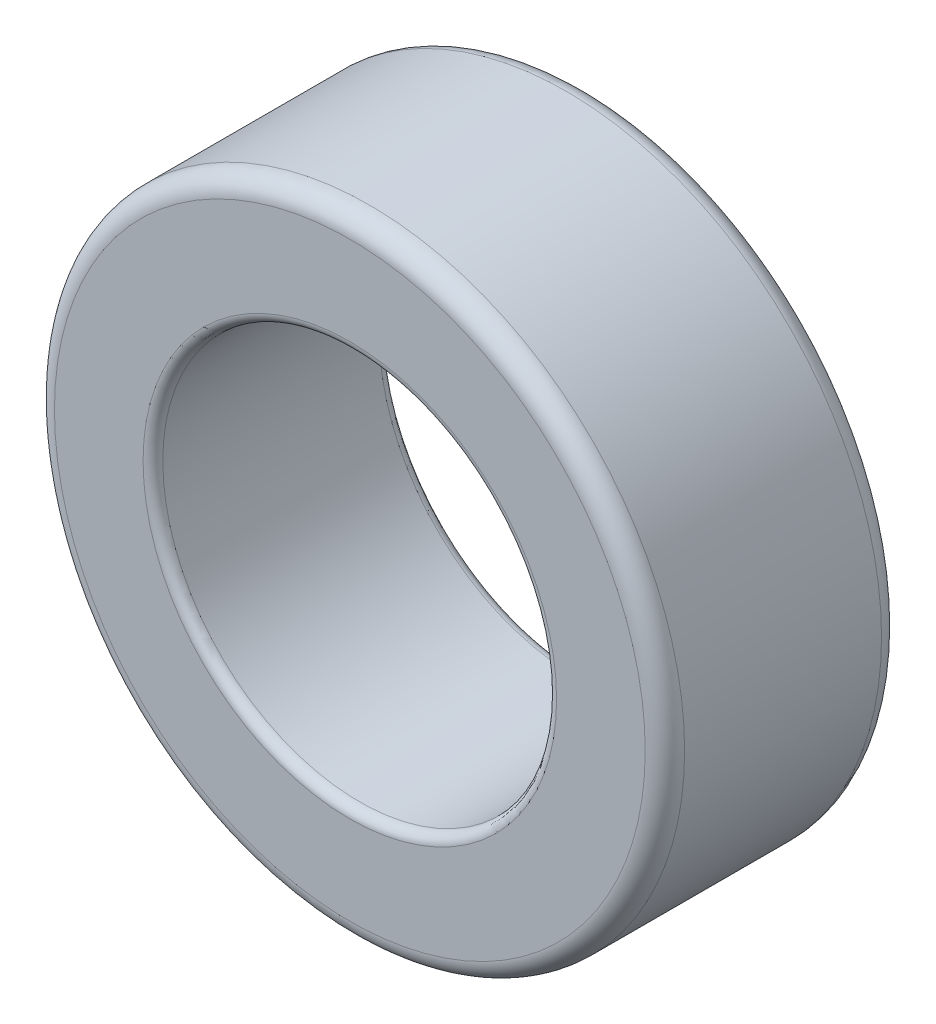
ISO-10303-21;
HEADER;
FILE_DESCRIPTION(('STEP AP214'),'2;1');
FILE_NAME('part.step','',(''),(''),'','','');
FILE_SCHEMA(('AUTOMOTIVE_DESIGN { 1 0 10303 214 1 1 1 1 }'));
ENDSEC;
DATA;
#1=APPLICATION_CONTEXT('core data for automotive mechanical design processes');
#2=APPLICATION_PROTOCOL_DEFINITION('international standard','automotive_design',2000,#1);
#3=PRODUCT_CONTEXT('',#1,'mechanical');
#4=PRODUCT('Part','Part','',(#3));
#5=PRODUCT_RELATED_PRODUCT_CATEGORY('part','',(#4));
#6=PRODUCT_DEFINITION_FORMATION('','',#4);
#7=PRODUCT_DEFINITION_CONTEXT('part definition',#1,'design');
#8=PRODUCT_DEFINITION('design','',#6,#7);
#9=PRODUCT_DEFINITION_SHAPE('','',#8);
#10=(LENGTH_UNIT() NAMED_UNIT(*) SI_UNIT(.MILLI.,.METRE.));
#11=(NAMED_UNIT(*) PLANE_ANGLE_UNIT() SI_UNIT($,.RADIAN.));
#12=(NAMED_UNIT(*) SI_UNIT($,.STERADIAN.) SOLID_ANGLE_UNIT());
#13=UNCERTAINTY_MEASURE_WITH_UNIT(LENGTH_MEASURE(1.E-05),#10,'distance_accuracy_value','');
#14=(GEOMETRIC_REPRESENTATION_CONTEXT(3) GLOBAL_UNCERTAINTY_ASSIGNED_CONTEXT((#13)) GLOBAL_UNIT_ASSIGNED_CONTEXT((#10,
#11,#12)) REPRESENTATION_CONTEXT('',''));
#15=CARTESIAN_POINT('',(0.,0.,0.));
#16=DIRECTION('',(0.,0.,1.));
#17=DIRECTION('',(1.,0.,0.));
#18=AXIS2_PLACEMENT_3D('',#15,#16,#17);
#19=CARTESIAN_POINT('',(0.,0.,6.));
#20=DIRECTION('',(0.,0.,-1.));
#21=DIRECTION('',(-1.,0.,0.));
#22=AXIS2_PLACEMENT_3D('',#19,#20,#21);
#23=CYLINDRICAL_SURFACE('',#22,10.);
#24=CARTESIAN_POINT('',(0.,0.,-5.5));
#25=DIRECTION('',(0.,0.,1.));
#26=DIRECTION('',(1.,0.,0.));
#27=AXIS2_PLACEMENT_3D('',#24,#25,#26);
#28=CIRCLE('',#27,10.);
#29=CARTESIAN_POINT('',(10.,0.,-5.5));
#30=VERTEX_POINT('',#29);
#31=EDGE_CURVE('E40',#30,#30,#28,.F.);
#32=ORIENTED_EDGE('',*,*,#31,.T.);
#33=EDGE_LOOP('',(#32));
#34=FACE_BOUND('',#33,.T.);
#35=CARTESIAN_POINT('',(0.,0.,5.5));
#36=DIRECTION('',(0.,0.,1.));
#37=DIRECTION('',(1.,0.,0.));
#38=AXIS2_PLACEMENT_3D('',#35,#36,#37);
#39=CIRCLE('',#38,10.);
#40=CARTESIAN_POINT('',(10.,0.,5.5));
#41=VERTEX_POINT('',#40);
#42=EDGE_CURVE('E44',#41,#41,#39,.T.);
#43=ORIENTED_EDGE('',*,*,#42,.T.);
#44=EDGE_LOOP('',(#43));
#45=FACE_BOUND('',#44,.T.);
#46=ADVANCED_FACE('F33',(#34,#45),#23,.F.);
#47=CARTESIAN_POINT('',(0.,0.,6.));
#48=DIRECTION('',(0.,0.,-1.));
#49=DIRECTION('',(-1.,0.,0.));
#50=AXIS2_PLACEMENT_3D('',#47,#48,#49);
#51=CYLINDRICAL_SURFACE('',#50,16.);
#52=CARTESIAN_POINT('',(0.,0.,-5.));
#53=DIRECTION('',(0.,0.,1.));
#54=DIRECTION('',(1.,0.,0.));
#55=AXIS2_PLACEMENT_3D('',#52,#53,#54);
#56=CIRCLE('',#55,16.);
#57=CARTESIAN_POINT('',(16.,0.,-5.));
#58=VERTEX_POINT('',#57);
#59=EDGE_CURVE('E59',#58,#58,#56,.T.);
#60=ORIENTED_EDGE('',*,*,#59,.T.);
#61=EDGE_LOOP('',(#60));
#62=FACE_BOUND('',#61,.T.);
#63=CARTESIAN_POINT('',(0.,0.,5.));
#64=DIRECTION('',(0.,0.,1.));
#65=DIRECTION('',(1.,0.,0.));
#66=AXIS2_PLACEMENT_3D('',#63,#64,#65);
#67=CIRCLE('',#66,16.);
#68=CARTESIAN_POINT('',(16.,0.,5.));
#69=VERTEX_POINT('',#68);
#70=EDGE_CURVE('E62',#69,#69,#67,.F.);
#71=ORIENTED_EDGE('',*,*,#70,.T.);
#72=EDGE_LOOP('',(#71));
#73=FACE_BOUND('',#72,.T.);
#74=ADVANCED_FACE('F66',(#62,#73),#51,.T.);
#75=CARTESIAN_POINT('',(0.,0.,6.));
#76=DIRECTION('',(0.,0.,1.));
#77=DIRECTION('',(1.,0.,0.));
#78=AXIS2_PLACEMENT_3D('',#75,#76,#77);
#79=PLANE('',#78);
#80=CARTESIAN_POINT('',(0.,0.,6.));
#81=DIRECTION('',(0.,0.,1.));
#82=DIRECTION('',(1.,0.,0.));
#83=AXIS2_PLACEMENT_3D('',#80,#81,#82);
#84=CIRCLE('',#83,10.5);
#85=CARTESIAN_POINT('',(10.5,0.,6.));
#86=VERTEX_POINT('',#85);
#87=EDGE_CURVE('E10',#86,#86,#84,.F.);
#88=ORIENTED_EDGE('',*,*,#87,.T.);
#89=EDGE_LOOP('',(#88));
#90=FACE_BOUND('',#89,.T.);
#91=CARTESIAN_POINT('',(0.,0.,6.));
#92=DIRECTION('',(0.,0.,1.));
#93=DIRECTION('',(1.,0.,0.));
#94=AXIS2_PLACEMENT_3D('',#91,#92,#93);
#95=CIRCLE('',#94,15.);
#96=CARTESIAN_POINT('',(15.,0.,6.));
#97=VERTEX_POINT('',#96);
#98=EDGE_CURVE('E53',#97,#97,#95,.T.);
#99=ORIENTED_EDGE('',*,*,#98,.T.);
#100=EDGE_LOOP('',(#99));
#101=FACE_BOUND('',#100,.T.);
#102=ADVANCED_FACE('F76',(#90,#101),#79,.T.);
#103=CARTESIAN_POINT('',(0.,0.,-6.));
#104=DIRECTION('',(0.,0.,1.));
#105=DIRECTION('',(1.,0.,0.));
#106=AXIS2_PLACEMENT_3D('',#103,#104,#105);
#107=PLANE('',#106);
#108=CARTESIAN_POINT('',(0.,0.,-6.));
#109=DIRECTION('',(0.,0.,1.));
#110=DIRECTION('',(1.,0.,0.));
#111=AXIS2_PLACEMENT_3D('',#108,#109,#110);
#112=CIRCLE('',#111,10.5);
#113=CARTESIAN_POINT('',(10.5,0.,-6.));
#114=VERTEX_POINT('',#113);
#115=EDGE_CURVE('E48',#114,#114,#112,.T.);
#116=ORIENTED_EDGE('',*,*,#115,.T.);
#117=EDGE_LOOP('',(#116));
#118=FACE_BOUND('',#117,.T.);
#119=CARTESIAN_POINT('',(0.,0.,-6.));
#120=DIRECTION('',(0.,0.,1.));
#121=DIRECTION('',(1.,0.,0.));
#122=AXIS2_PLACEMENT_3D('',#119,#120,#121);
#123=CIRCLE('',#122,15.);
#124=CARTESIAN_POINT('',(15.,0.,-6.));
#125=VERTEX_POINT('',#124);
#126=EDGE_CURVE('E56',#125,#125,#123,.F.);
#127=ORIENTED_EDGE('',*,*,#126,.T.);
#128=EDGE_LOOP('',(#127));
#129=FACE_BOUND('',#128,.T.);
#130=ADVANCED_FACE('F78',(#118,#129),#107,.F.);
#131=CARTESIAN_POINT('',(0.,0.,-5.));
#132=DIRECTION('',(0.,0.,1.));
#133=DIRECTION('',(1.,0.,0.));
#134=AXIS2_PLACEMENT_3D('',#131,#132,#133);
#135=TOROIDAL_SURFACE('',#134,15.,1.);
#136=ORIENTED_EDGE('',*,*,#126,.F.);
#137=EDGE_LOOP('',(#136));
#138=FACE_BOUND('',#137,.T.);
#139=ORIENTED_EDGE('',*,*,#59,.F.);
#140=EDGE_LOOP('',(#139));
#141=FACE_BOUND('',#140,.T.);
#142=ADVANCED_FACE('F72',(#138,#141),#135,.T.);
#143=CARTESIAN_POINT('',(0.,0.,5.));
#144=DIRECTION('',(0.,0.,1.));
#145=DIRECTION('',(1.,0.,0.));
#146=AXIS2_PLACEMENT_3D('',#143,#144,#145);
#147=TOROIDAL_SURFACE('',#146,15.,1.);
#148=ORIENTED_EDGE('',*,*,#70,.F.);
#149=EDGE_LOOP('',(#148));
#150=FACE_BOUND('',#149,.T.);
#151=ORIENTED_EDGE('',*,*,#98,.F.);
#152=EDGE_LOOP('',(#151));
#153=FACE_BOUND('',#152,.T.);
#154=ADVANCED_FACE('F68',(#150,#153),#147,.T.);
#155=CARTESIAN_POINT('',(0.,0.,-5.5));
#156=DIRECTION('',(0.,0.,1.));
#157=DIRECTION('',(1.,0.,0.));
#158=AXIS2_PLACEMENT_3D('',#155,#156,#157);
#159=TOROIDAL_SURFACE('',#158,10.5,0.5);
#160=ORIENTED_EDGE('',*,*,#31,.F.);
#161=EDGE_LOOP('',(#160));
#162=FACE_BOUND('',#161,.T.);
#163=ORIENTED_EDGE('',*,*,#115,.F.);
#164=EDGE_LOOP('',(#163));
#165=FACE_BOUND('',#164,.T.);
#166=ADVANCED_FACE('F71',(#162,#165),#159,.T.);
#167=CARTESIAN_POINT('',(0.,0.,5.5));
#168=DIRECTION('',(0.,0.,1.));
#169=DIRECTION('',(1.,0.,0.));
#170=AXIS2_PLACEMENT_3D('',#167,#168,#169);
#171=TOROIDAL_SURFACE('',#170,10.5,0.5);
#172=ORIENTED_EDGE('',*,*,#87,.F.);
#173=EDGE_LOOP('',(#172));
#174=FACE_BOUND('',#173,.T.);
#175=ORIENTED_EDGE('',*,*,#42,.F.);
#176=EDGE_LOOP('',(#175));
#177=FACE_BOUND('',#176,.T.);
#178=ADVANCED_FACE('F35',(#174,#177),#171,.T.);
#179=CLOSED_SHELL('',(#46,#74,#102,#130,#142,#154,#166,#178));
#180=MANIFOLD_SOLID_BREP('B2',#179);
#181=ADVANCED_BREP_SHAPE_REPRESENTATION('',(#18,#180),#14);
#182=SHAPE_DEFINITION_REPRESENTATION(#9,#181);
ENDSEC;
END-ISO-10303-21;
